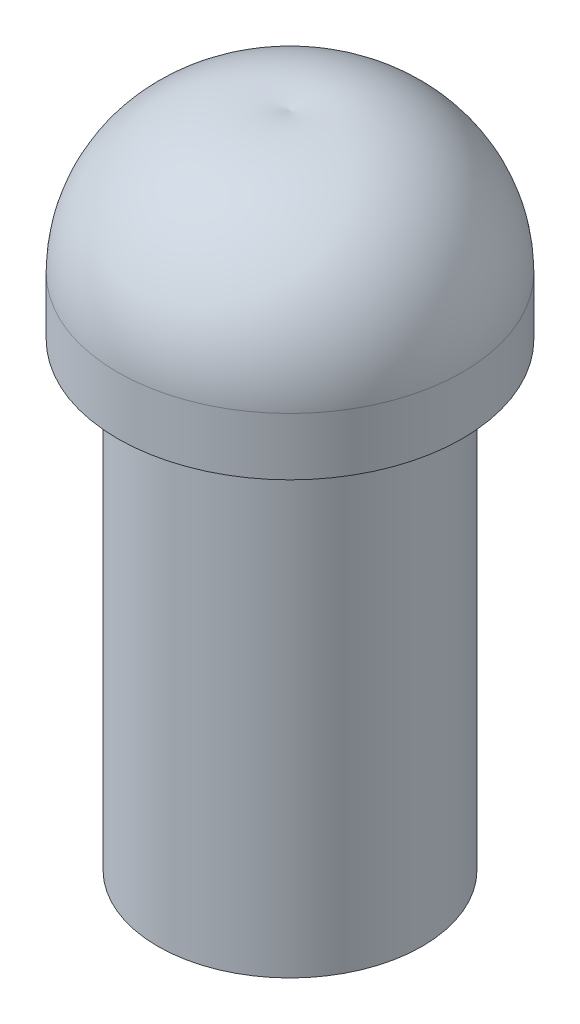
ISO-10303-21;
HEADER;
FILE_DESCRIPTION(('STEP AP214'),'2;1');
FILE_NAME('part.step','',(''),(''),'','','');
FILE_SCHEMA(('AUTOMOTIVE_DESIGN { 1 0 10303 214 1 1 1 1 }'));
ENDSEC;
DATA;
#1=APPLICATION_CONTEXT('core data for automotive mechanical design processes');
#2=APPLICATION_PROTOCOL_DEFINITION('international standard','automotive_design',2000,#1);
#3=PRODUCT_CONTEXT('',#1,'mechanical');
#4=PRODUCT('Part','Part','',(#3));
#5=PRODUCT_RELATED_PRODUCT_CATEGORY('part','',(#4));
#6=PRODUCT_DEFINITION_FORMATION('','',#4);
#7=PRODUCT_DEFINITION_CONTEXT('part definition',#1,'design');
#8=PRODUCT_DEFINITION('design','',#6,#7);
#9=PRODUCT_DEFINITION_SHAPE('','',#8);
#10=(LENGTH_UNIT() NAMED_UNIT(*) SI_UNIT(.MILLI.,.METRE.));
#11=(NAMED_UNIT(*) PLANE_ANGLE_UNIT() SI_UNIT($,.RADIAN.));
#12=(NAMED_UNIT(*) SI_UNIT($,.STERADIAN.) SOLID_ANGLE_UNIT());
#13=UNCERTAINTY_MEASURE_WITH_UNIT(LENGTH_MEASURE(1.E-05),#10,'distance_accuracy_value','');
#14=(GEOMETRIC_REPRESENTATION_CONTEXT(3) GLOBAL_UNCERTAINTY_ASSIGNED_CONTEXT((#13)) GLOBAL_UNIT_ASSIGNED_CONTEXT((#10,
#11,#12)) REPRESENTATION_CONTEXT('',''));
#15=CARTESIAN_POINT('',(0.,0.,0.));
#16=DIRECTION('',(0.,0.,1.));
#17=DIRECTION('',(1.,0.,0.));
#18=AXIS2_PLACEMENT_3D('',#15,#16,#17);
#19=CARTESIAN_POINT('',(-0.5,4.11209091988474,0.));
#20=DIRECTION('',(0.,0.,-1.));
#21=DIRECTION('',(-1.,0.,0.));
#22=AXIS2_PLACEMENT_3D('',#19,#20,#21);
#23=CIRCLE('',#22,2.5);
#24=TRIMMED_CURVE('',#23,(PARAMETER_VALUE(-1.77215424758523)),
(PARAMETER_VALUE(1.77215424758523)),.T.,.PARAMETER.);
#25=CARTESIAN_POINT('',(0.,4.11209091988474,0.));
#26=DIRECTION('',(0.,1.,0.));
#27=AXIS1_PLACEMENT('',#25,#26);
#28=SURFACE_OF_REVOLUTION('',#24,#27);
#29=CARTESIAN_POINT('',(0.,6.56158066266791,0.));
#30=VERTEX_POINT('',#29);
#31=VERTEX_LOOP('',#30);
#32=FACE_BOUND('',#31,.T.);
#33=CARTESIAN_POINT('',(0.,4.11209091988474,0.));
#34=DIRECTION('',(0.,1.,0.));
#35=DIRECTION('',(-1.,0.,0.));
#36=AXIS2_PLACEMENT_3D('',#33,#34,#35);
#37=CIRCLE('',#36,3.);
#38=CARTESIAN_POINT('',(-3.,4.11209091988474,0.));
#39=VERTEX_POINT('',#38);
#40=EDGE_CURVE('E11',#39,#39,#37,.T.);
#41=ORIENTED_EDGE('',*,*,#40,.T.);
#42=EDGE_LOOP('',(#41));
#43=FACE_BOUND('',#42,.T.);
#44=ADVANCED_FACE('F41',(#32,#43),#28,.T.);
#45=CARTESIAN_POINT('',(0.,6.56158066266791,0.));
#46=DIRECTION('',(0.,1.,0.));
#47=DIRECTION('',(-1.,0.,0.));
#48=AXIS2_PLACEMENT_3D('',#45,#46,#47);
#49=CYLINDRICAL_SURFACE('',#48,3.);
#50=CARTESIAN_POINT('',(0.,3.11209091988474,0.));
#51=DIRECTION('',(0.,1.,0.));
#52=DIRECTION('',(-1.,0.,0.));
#53=AXIS2_PLACEMENT_3D('',#50,#51,#52);
#54=CIRCLE('',#53,3.);
#55=CARTESIAN_POINT('',(-3.,3.11209091988474,0.));
#56=VERTEX_POINT('',#55);
#57=EDGE_CURVE('E48',#56,#56,#54,.T.);
#58=ORIENTED_EDGE('',*,*,#57,.T.);
#59=EDGE_LOOP('',(#58));
#60=FACE_BOUND('',#59,.T.);
#61=ORIENTED_EDGE('',*,*,#40,.F.);
#62=EDGE_LOOP('',(#61));
#63=FACE_BOUND('',#62,.T.);
#64=ADVANCED_FACE('F53',(#60,#63),#49,.T.);
#65=CARTESIAN_POINT('',(0.,3.11209091988474,0.));
#66=DIRECTION('',(0.,-1.,0.));
#67=DIRECTION('',(1.,0.,0.));
#68=AXIS2_PLACEMENT_3D('',#65,#66,#67);
#69=PLANE('',#68);
#70=CARTESIAN_POINT('',(0.,3.11209091988474,0.));
#71=DIRECTION('',(0.,1.,0.));
#72=DIRECTION('',(-1.,0.,0.));
#73=AXIS2_PLACEMENT_3D('',#70,#71,#72);
#74=CIRCLE('',#73,2.3);
#75=CARTESIAN_POINT('',(-2.3,3.11209091988474,0.));
#76=VERTEX_POINT('',#75);
#77=EDGE_CURVE('E97',#76,#76,#74,.T.);
#78=ORIENTED_EDGE('',*,*,#77,.T.);
#79=EDGE_LOOP('',(#78));
#80=FACE_BOUND('',#79,.T.);
#81=ORIENTED_EDGE('',*,*,#57,.F.);
#82=EDGE_LOOP('',(#81));
#83=FACE_BOUND('',#82,.T.);
#84=ADVANCED_FACE('F57',(#80,#83),#69,.T.);
#85=CARTESIAN_POINT('',(0.,6.56158066266791,0.));
#86=DIRECTION('',(0.,1.,0.));
#87=DIRECTION('',(-1.,0.,0.));
#88=AXIS2_PLACEMENT_3D('',#85,#86,#87);
#89=CYLINDRICAL_SURFACE('',#88,2.3);
#90=CARTESIAN_POINT('',(0.,-4.88790908011526,0.));
#91=DIRECTION('',(0.,1.,0.));
#92=DIRECTION('',(-1.,0.,0.));
#93=AXIS2_PLACEMENT_3D('',#90,#91,#92);
#94=CIRCLE('',#93,2.3);
#95=CARTESIAN_POINT('',(-2.3,-4.88790908011526,0.));
#96=VERTEX_POINT('',#95);
#97=EDGE_CURVE('E91',#96,#96,#94,.T.);
#98=ORIENTED_EDGE('',*,*,#97,.T.);
#99=EDGE_LOOP('',(#98));
#100=FACE_BOUND('',#99,.T.);
#101=ORIENTED_EDGE('',*,*,#77,.F.);
#102=EDGE_LOOP('',(#101));
#103=FACE_BOUND('',#102,.T.);
#104=ADVANCED_FACE('F62',(#100,#103),#89,.T.);
#105=CARTESIAN_POINT('',(0.,-4.88790908011526,0.));
#106=DIRECTION('',(0.,-1.,0.));
#107=DIRECTION('',(1.,0.,0.));
#108=AXIS2_PLACEMENT_3D('',#105,#106,#107);
#109=PLANE('',#108);
#110=CARTESIAN_POINT('',(0.,-4.88790908011526,0.));
#111=DIRECTION('',(0.,1.,0.));
#112=DIRECTION('',(-1.,0.,0.));
#113=AXIS2_PLACEMENT_3D('',#110,#111,#112);
#114=CIRCLE('',#113,1.55);
#115=CARTESIAN_POINT('',(-1.55,-4.88790908011526,0.));
#116=VERTEX_POINT('',#115);
#117=EDGE_CURVE('E87',#116,#116,#114,.T.);
#118=ORIENTED_EDGE('',*,*,#117,.T.);
#119=EDGE_LOOP('',(#118));
#120=FACE_BOUND('',#119,.T.);
#121=ORIENTED_EDGE('',*,*,#97,.F.);
#122=EDGE_LOOP('',(#121));
#123=FACE_BOUND('',#122,.T.);
#124=ADVANCED_FACE('F69',(#120,#123),#109,.T.);
#125=CARTESIAN_POINT('',(0.,6.56158066266791,0.));
#126=DIRECTION('',(0.,1.,0.));
#127=DIRECTION('',(-1.,0.,0.));
#128=AXIS2_PLACEMENT_3D('',#125,#126,#127);
#129=CYLINDRICAL_SURFACE('',#128,1.55);
#130=CARTESIAN_POINT('',(0.,2.26229508196721,0.));
#131=DIRECTION('',(0.,1.,0.));
#132=DIRECTION('',(-1.,0.,0.));
#133=AXIS2_PLACEMENT_3D('',#130,#131,#132);
#134=CIRCLE('',#133,1.55);
#135=CARTESIAN_POINT('',(-1.55,2.26229508196721,0.));
#136=VERTEX_POINT('',#135);
#137=EDGE_CURVE('E85',#136,#136,#134,.T.);
#138=ORIENTED_EDGE('',*,*,#137,.T.);
#139=EDGE_LOOP('',(#138));
#140=FACE_BOUND('',#139,.T.);
#141=ORIENTED_EDGE('',*,*,#117,.F.);
#142=EDGE_LOOP('',(#141));
#143=FACE_BOUND('',#142,.T.);
#144=ADVANCED_FACE('F73',(#140,#143),#129,.F.);
#145=CARTESIAN_POINT('',(0.,2.26229508196721,0.));
#146=DIRECTION('',(0.,-1.,0.));
#147=DIRECTION('',(1.,0.,0.));
#148=AXIS2_PLACEMENT_3D('',#145,#146,#147);
#149=PLANE('',#148);
#150=ORIENTED_EDGE('',*,*,#137,.F.);
#151=EDGE_LOOP('',(#150));
#152=FACE_BOUND('',#151,.T.);
#153=ADVANCED_FACE('F77',(#152),#149,.T.);
#154=CLOSED_SHELL('',(#44,#64,#84,#104,#124,#144,#153));
#155=MANIFOLD_SOLID_BREP('B2',#154);
#156=ADVANCED_BREP_SHAPE_REPRESENTATION('',(#18,#155),#14);
#157=SHAPE_DEFINITION_REPRESENTATION(#9,#156);
ENDSEC;
END-ISO-10303-21;
